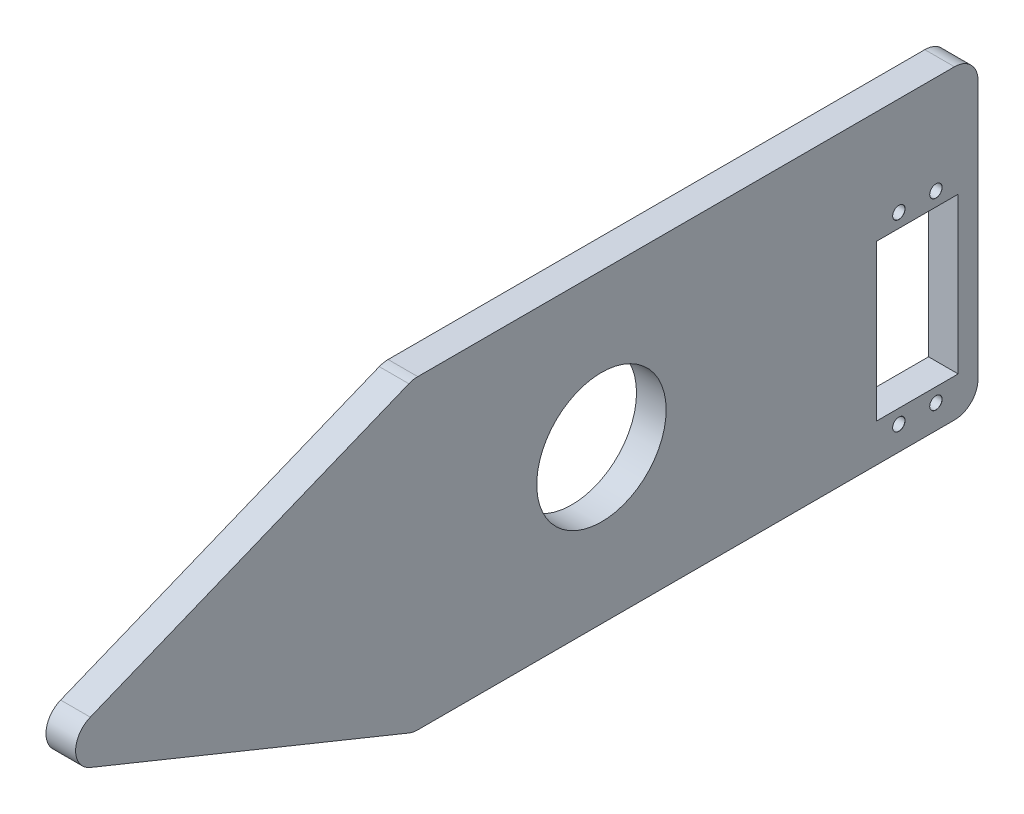
ISO-10303-21;
HEADER;
FILE_DESCRIPTION(('STEP AP214'),'2;1');
FILE_NAME('part.step','',(''),(''),'','','');
FILE_SCHEMA(('AUTOMOTIVE_DESIGN { 1 0 10303 214 1 1 1 1 }'));
ENDSEC;
DATA;
#1=APPLICATION_CONTEXT('core data for automotive mechanical design processes');
#2=APPLICATION_PROTOCOL_DEFINITION('international standard','automotive_design',2000,#1);
#3=PRODUCT_CONTEXT('',#1,'mechanical');
#4=PRODUCT('Part','Part','',(#3));
#5=PRODUCT_RELATED_PRODUCT_CATEGORY('part','',(#4));
#6=PRODUCT_DEFINITION_FORMATION('','',#4);
#7=PRODUCT_DEFINITION_CONTEXT('part definition',#1,'design');
#8=PRODUCT_DEFINITION('design','',#6,#7);
#9=PRODUCT_DEFINITION_SHAPE('','',#8);
#10=(LENGTH_UNIT() NAMED_UNIT(*) SI_UNIT(.MILLI.,.METRE.));
#11=(NAMED_UNIT(*) PLANE_ANGLE_UNIT() SI_UNIT($,.RADIAN.));
#12=(NAMED_UNIT(*) SI_UNIT($,.STERADIAN.) SOLID_ANGLE_UNIT());
#13=UNCERTAINTY_MEASURE_WITH_UNIT(LENGTH_MEASURE(1.E-05),#10,'distance_accuracy_value','');
#14=(GEOMETRIC_REPRESENTATION_CONTEXT(3) GLOBAL_UNCERTAINTY_ASSIGNED_CONTEXT((#13)) GLOBAL_UNIT_ASSIGNED_CONTEXT((#10,
#11,#12)) REPRESENTATION_CONTEXT('',''));
#15=CARTESIAN_POINT('',(0.,0.,0.));
#16=DIRECTION('',(0.,0.,1.));
#17=DIRECTION('',(1.,0.,0.));
#18=AXIS2_PLACEMENT_3D('',#15,#16,#17);
#19=CARTESIAN_POINT('',(4.0005,0.,0.));
#20=DIRECTION('',(1.,0.,0.));
#21=DIRECTION('',(0.,0.,-1.));
#22=AXIS2_PLACEMENT_3D('',#19,#20,#21);
#23=PLANE('',#22);
#24=DIRECTION('',(0.,1.,0.));
#25=VECTOR('',#24,1.);
#26=CARTESIAN_POINT('',(4.0005,-31.,-96.25));
#27=LINE('',#26,#25);
#28=CARTESIAN_POINT('',(4.0005,-31.,-96.25));
#29=VERTEX_POINT('',#28);
#30=CARTESIAN_POINT('',(4.0005,11.,-96.25));
#31=VERTEX_POINT('',#30);
#32=EDGE_CURVE('E53',#29,#31,#27,.T.);
#33=ORIENTED_EDGE('',*,*,#32,.F.);
#34=DIRECTION('',(0.,0.,-1.));
#35=VECTOR('',#34,1.);
#36=CARTESIAN_POINT('',(4.0005,-31.,-74.25));
#37=LINE('',#36,#35);
#38=CARTESIAN_POINT('',(4.0005,-31.,-74.25));
#39=VERTEX_POINT('',#38);
#40=EDGE_CURVE('E160',#39,#29,#37,.T.);
#41=ORIENTED_EDGE('',*,*,#40,.F.);
#42=DIRECTION('',(0.,-1.,0.));
#43=VECTOR('',#42,1.);
#44=CARTESIAN_POINT('',(4.0005,11.,-74.25));
#45=LINE('',#44,#43);
#46=CARTESIAN_POINT('',(4.0005,11.,-74.25));
#47=VERTEX_POINT('',#46);
#48=EDGE_CURVE('E159',#47,#39,#45,.T.);
#49=ORIENTED_EDGE('',*,*,#48,.F.);
#50=DIRECTION('',(0.,0.,1.));
#51=VECTOR('',#50,1.);
#52=CARTESIAN_POINT('',(4.0005,11.,-96.25));
#53=LINE('',#52,#51);
#54=EDGE_CURVE('E168',#31,#47,#53,.T.);
#55=ORIENTED_EDGE('',*,*,#54,.F.);
#56=EDGE_LOOP('',(#33,#41,#49,#55));
#57=FACE_BOUND('',#56,.T.);
#58=CARTESIAN_POINT('',(4.0005,-34.75,-80.25));
#59=DIRECTION('',(1.,0.,0.));
#60=DIRECTION('',(0.,0.,-1.));
#61=AXIS2_PLACEMENT_3D('',#58,#59,#60);
#62=CIRCLE('',#61,1.675);
#63=CARTESIAN_POINT('',(4.0005,-34.75,-81.925));
#64=VERTEX_POINT('',#63);
#65=EDGE_CURVE('E175',#64,#64,#62,.T.);
#66=ORIENTED_EDGE('',*,*,#65,.F.);
#67=EDGE_LOOP('',(#66));
#68=FACE_BOUND('',#67,.T.);
#69=CARTESIAN_POINT('',(4.0005,-34.75,-90.25));
#70=DIRECTION('',(1.,0.,0.));
#71=DIRECTION('',(0.,0.,-1.));
#72=AXIS2_PLACEMENT_3D('',#69,#70,#71);
#73=CIRCLE('',#72,1.675);
#74=CARTESIAN_POINT('',(4.0005,-34.75,-91.925));
#75=VERTEX_POINT('',#74);
#76=EDGE_CURVE('E183',#75,#75,#73,.T.);
#77=ORIENTED_EDGE('',*,*,#76,.F.);
#78=EDGE_LOOP('',(#77));
#79=FACE_BOUND('',#78,.T.);
#80=CARTESIAN_POINT('',(4.0005,14.75,-80.25));
#81=DIRECTION('',(1.,0.,0.));
#82=DIRECTION('',(0.,0.,-1.));
#83=AXIS2_PLACEMENT_3D('',#80,#81,#82);
#84=CIRCLE('',#83,1.675);
#85=CARTESIAN_POINT('',(4.0005,14.75,-81.925));
#86=VERTEX_POINT('',#85);
#87=EDGE_CURVE('E194',#86,#86,#84,.T.);
#88=ORIENTED_EDGE('',*,*,#87,.F.);
#89=EDGE_LOOP('',(#88));
#90=FACE_BOUND('',#89,.T.);
#91=CARTESIAN_POINT('',(4.0005,14.75,-90.25));
#92=DIRECTION('',(1.,0.,0.));
#93=DIRECTION('',(0.,0.,-1.));
#94=AXIS2_PLACEMENT_3D('',#91,#92,#93);
#95=CIRCLE('',#94,1.675);
#96=CARTESIAN_POINT('',(4.0005,14.75,-91.925));
#97=VERTEX_POINT('',#96);
#98=EDGE_CURVE('E205',#97,#97,#95,.T.);
#99=ORIENTED_EDGE('',*,*,#98,.F.);
#100=EDGE_LOOP('',(#99));
#101=FACE_BOUND('',#100,.T.);
#102=DIRECTION('',(0.,1.,0.));
#103=VECTOR('',#102,1.);
#104=CARTESIAN_POINT('',(4.0005,-41.275,-101.6));
#105=LINE('',#104,#103);
#106=CARTESIAN_POINT('',(4.0005,-34.925,-101.6));
#107=VERTEX_POINT('',#106);
#108=CARTESIAN_POINT('',(4.0005,34.925,-101.6));
#109=VERTEX_POINT('',#108);
#110=EDGE_CURVE('E224',#107,#109,#105,.T.);
#111=ORIENTED_EDGE('',*,*,#110,.T.);
#112=CARTESIAN_POINT('',(4.0005,34.925,-95.25));
#113=DIRECTION('',(1.,0.,0.));
#114=DIRECTION('',(0.,0.,-1.));
#115=AXIS2_PLACEMENT_3D('',#112,#113,#114);
#116=CIRCLE('',#115,6.35);
#117=CARTESIAN_POINT('',(4.0005,41.275,-95.25));
#118=VERTEX_POINT('',#117);
#119=EDGE_CURVE('E273',#109,#118,#116,.T.);
#120=ORIENTED_EDGE('',*,*,#119,.T.);
#121=DIRECTION('',(0.,0.,1.));
#122=VECTOR('',#121,1.);
#123=CARTESIAN_POINT('',(4.0005,41.275,-101.6));
#124=LINE('',#123,#122);
#125=CARTESIAN_POINT('',(4.0005,41.275,49.5593897155795));
#126=VERTEX_POINT('',#125);
#127=EDGE_CURVE('E226',#118,#126,#124,.T.);
#128=ORIENTED_EDGE('',*,*,#127,.T.);
#129=CARTESIAN_POINT('',(4.0005,34.925,49.5593897155796));
#130=DIRECTION('',(1.,0.,0.));
#131=DIRECTION('',(0.,0.,-1.));
#132=AXIS2_PLACEMENT_3D('',#129,#130,#131);
#133=CIRCLE('',#132,6.35);
#134=CARTESIAN_POINT('',(4.0005,40.8080627647267,51.9493839637498));
#135=VERTEX_POINT('',#134);
#136=EDGE_CURVE('E270',#126,#135,#133,.T.);
#137=ORIENTED_EDGE('',*,*,#136,.T.);
#138=DIRECTION('',(0.,-0.376377046955938,0.926466577122309));
#139=VECTOR('',#138,1.);
#140=CARTESIAN_POINT('',(4.0005,41.275,50.8));
#141=LINE('',#140,#139);
#142=CARTESIAN_POINT('',(4.0005,5.88306276472666,137.918614732981));
#143=VERTEX_POINT('',#142);
#144=EDGE_CURVE('E233',#135,#143,#141,.T.);
#145=ORIENTED_EDGE('',*,*,#144,.T.);
#146=CARTESIAN_POINT('',(4.0005,0.,135.52862048481));
#147=DIRECTION('',(1.,0.,0.));
#148=DIRECTION('',(0.,0.,-1.));
#149=AXIS2_PLACEMENT_3D('',#146,#147,#148);
#150=CIRCLE('',#149,6.35);
#151=CARTESIAN_POINT('',(4.0005,-5.88306276472666,137.918614732981));
#152=VERTEX_POINT('',#151);
#153=EDGE_CURVE('E272',#143,#152,#150,.T.);
#154=ORIENTED_EDGE('',*,*,#153,.T.);
#155=DIRECTION('',(0.,-0.376377046955938,-0.926466577122309));
#156=VECTOR('',#155,1.);
#157=CARTESIAN_POINT('',(4.0005,0.,152.4));
#158=LINE('',#157,#156);
#159=CARTESIAN_POINT('',(4.0005,-40.8080627647266,51.9493839637498));
#160=VERTEX_POINT('',#159);
#161=EDGE_CURVE('E218',#152,#160,#158,.T.);
#162=ORIENTED_EDGE('',*,*,#161,.T.);
#163=CARTESIAN_POINT('',(4.0005,-34.925,49.5593897155795));
#164=DIRECTION('',(1.,0.,0.));
#165=DIRECTION('',(0.,0.,-1.));
#166=AXIS2_PLACEMENT_3D('',#163,#164,#165);
#167=CIRCLE('',#166,6.35);
#168=CARTESIAN_POINT('',(4.0005,-41.275,49.5593897155795));
#169=VERTEX_POINT('',#168);
#170=EDGE_CURVE('E268',#160,#169,#167,.T.);
#171=ORIENTED_EDGE('',*,*,#170,.T.);
#172=DIRECTION('',(0.,0.,-1.));
#173=VECTOR('',#172,1.);
#174=CARTESIAN_POINT('',(4.0005,-41.275,50.8));
#175=LINE('',#174,#173);
#176=CARTESIAN_POINT('',(4.0005,-41.275,-95.25));
#177=VERTEX_POINT('',#176);
#178=EDGE_CURVE('E221',#169,#177,#175,.T.);
#179=ORIENTED_EDGE('',*,*,#178,.T.);
#180=CARTESIAN_POINT('',(4.0005,-34.925,-95.25));
#181=DIRECTION('',(1.,0.,0.));
#182=DIRECTION('',(0.,0.,-1.));
#183=AXIS2_PLACEMENT_3D('',#180,#181,#182);
#184=CIRCLE('',#183,6.35);
#185=EDGE_CURVE('E271',#177,#107,#184,.T.);
#186=ORIENTED_EDGE('',*,*,#185,.T.);
#187=EDGE_LOOP('',(#111,#120,#128,#137,#145,#154,#162,#171,#179,#186));
#188=FACE_BOUND('',#187,.T.);
#189=CARTESIAN_POINT('',(4.0005,0.,0.));
#190=DIRECTION('',(1.,0.,0.));
#191=DIRECTION('',(0.,0.,-1.));
#192=AXIS2_PLACEMENT_3D('',#189,#190,#191);
#193=CIRCLE('',#192,17.4625);
#194=CARTESIAN_POINT('',(4.0005,0.,-17.4625));
#195=VERTEX_POINT('',#194);
#196=EDGE_CURVE('E215',#195,#195,#193,.T.);
#197=ORIENTED_EDGE('',*,*,#196,.F.);
#198=EDGE_LOOP('',(#197));
#199=FACE_BOUND('',#198,.T.);
#200=ADVANCED_FACE('F39',(#57,#68,#79,#90,#101,#188,#199),#23,.T.);
#201=CARTESIAN_POINT('',(-4.0005,0.,0.));
#202=DIRECTION('',(1.,0.,0.));
#203=DIRECTION('',(0.,0.,-1.));
#204=AXIS2_PLACEMENT_3D('',#201,#202,#203);
#205=PLANE('',#204);
#206=DIRECTION('',(0.,0.,-1.));
#207=VECTOR('',#206,1.);
#208=CARTESIAN_POINT('',(-4.0005,-31.,-74.25));
#209=LINE('',#208,#207);
#210=CARTESIAN_POINT('',(-4.0005,-31.,-74.25));
#211=VERTEX_POINT('',#210);
#212=CARTESIAN_POINT('',(-4.0005,-31.,-96.25));
#213=VERTEX_POINT('',#212);
#214=EDGE_CURVE('E150',#211,#213,#209,.T.);
#215=ORIENTED_EDGE('',*,*,#214,.T.);
#216=DIRECTION('',(0.,1.,0.));
#217=VECTOR('',#216,1.);
#218=CARTESIAN_POINT('',(-4.0005,-31.,-96.25));
#219=LINE('',#218,#217);
#220=CARTESIAN_POINT('',(-4.0005,11.,-96.25));
#221=VERTEX_POINT('',#220);
#222=EDGE_CURVE('E142',#213,#221,#219,.T.);
#223=ORIENTED_EDGE('',*,*,#222,.T.);
#224=DIRECTION('',(0.,0.,1.));
#225=VECTOR('',#224,1.);
#226=CARTESIAN_POINT('',(-4.0005,11.,-96.25));
#227=LINE('',#226,#225);
#228=CARTESIAN_POINT('',(-4.0005,11.,-74.25));
#229=VERTEX_POINT('',#228);
#230=EDGE_CURVE('E148',#221,#229,#227,.T.);
#231=ORIENTED_EDGE('',*,*,#230,.T.);
#232=DIRECTION('',(0.,-1.,0.));
#233=VECTOR('',#232,1.);
#234=CARTESIAN_POINT('',(-4.0005,11.,-74.25));
#235=LINE('',#234,#233);
#236=EDGE_CURVE('E65',#229,#211,#235,.T.);
#237=ORIENTED_EDGE('',*,*,#236,.T.);
#238=EDGE_LOOP('',(#215,#223,#231,#237));
#239=FACE_BOUND('',#238,.T.);
#240=CARTESIAN_POINT('',(-4.0005,-34.75,-80.25));
#241=DIRECTION('',(1.,0.,0.));
#242=DIRECTION('',(0.,0.,-1.));
#243=AXIS2_PLACEMENT_3D('',#240,#241,#242);
#244=CIRCLE('',#243,1.65);
#245=CARTESIAN_POINT('',(-4.0005,-34.75,-81.9));
#246=VERTEX_POINT('',#245);
#247=EDGE_CURVE('E181',#246,#246,#244,.T.);
#248=ORIENTED_EDGE('',*,*,#247,.T.);
#249=EDGE_LOOP('',(#248));
#250=FACE_BOUND('',#249,.T.);
#251=CARTESIAN_POINT('',(-4.0005,-34.75,-90.25));
#252=DIRECTION('',(1.,0.,0.));
#253=DIRECTION('',(0.,0.,-1.));
#254=AXIS2_PLACEMENT_3D('',#251,#252,#253);
#255=CIRCLE('',#254,1.65);
#256=CARTESIAN_POINT('',(-4.0005,-34.75,-91.9));
#257=VERTEX_POINT('',#256);
#258=EDGE_CURVE('E188',#257,#257,#255,.T.);
#259=ORIENTED_EDGE('',*,*,#258,.T.);
#260=EDGE_LOOP('',(#259));
#261=FACE_BOUND('',#260,.T.);
#262=CARTESIAN_POINT('',(-4.0005,14.75,-80.25));
#263=DIRECTION('',(1.,0.,0.));
#264=DIRECTION('',(0.,0.,-1.));
#265=AXIS2_PLACEMENT_3D('',#262,#263,#264);
#266=CIRCLE('',#265,1.65);
#267=CARTESIAN_POINT('',(-4.0005,14.75,-81.9));
#268=VERTEX_POINT('',#267);
#269=EDGE_CURVE('E197',#268,#268,#266,.T.);
#270=ORIENTED_EDGE('',*,*,#269,.T.);
#271=EDGE_LOOP('',(#270));
#272=FACE_BOUND('',#271,.T.);
#273=CARTESIAN_POINT('',(-4.0005,14.75,-90.25));
#274=DIRECTION('',(1.,0.,0.));
#275=DIRECTION('',(0.,0.,-1.));
#276=AXIS2_PLACEMENT_3D('',#273,#274,#275);
#277=CIRCLE('',#276,1.65);
#278=CARTESIAN_POINT('',(-4.0005,14.75,-91.9));
#279=VERTEX_POINT('',#278);
#280=EDGE_CURVE('E206',#279,#279,#277,.T.);
#281=ORIENTED_EDGE('',*,*,#280,.T.);
#282=EDGE_LOOP('',(#281));
#283=FACE_BOUND('',#282,.T.);
#284=DIRECTION('',(0.,0.,1.));
#285=VECTOR('',#284,1.);
#286=CARTESIAN_POINT('',(-4.0005,41.275,-101.6));
#287=LINE('',#286,#285);
#288=CARTESIAN_POINT('',(-4.0005,41.275,-95.25));
#289=VERTEX_POINT('',#288);
#290=CARTESIAN_POINT('',(-4.0005,41.275,49.5593897155795));
#291=VERTEX_POINT('',#290);
#292=EDGE_CURVE('E243',#289,#291,#287,.T.);
#293=ORIENTED_EDGE('',*,*,#292,.F.);
#294=CARTESIAN_POINT('',(-4.0005,34.925,-95.25));
#295=DIRECTION('',(1.,0.,0.));
#296=DIRECTION('',(0.,0.,-1.));
#297=AXIS2_PLACEMENT_3D('',#294,#295,#296);
#298=CIRCLE('',#297,6.35);
#299=CARTESIAN_POINT('',(-4.0005,34.925,-101.6));
#300=VERTEX_POINT('',#299);
#301=EDGE_CURVE('E258',#289,#300,#298,.F.);
#302=ORIENTED_EDGE('',*,*,#301,.T.);
#303=DIRECTION('',(0.,1.,0.));
#304=VECTOR('',#303,1.);
#305=CARTESIAN_POINT('',(-4.0005,-41.275,-101.6));
#306=LINE('',#305,#304);
#307=CARTESIAN_POINT('',(-4.0005,-34.925,-101.6));
#308=VERTEX_POINT('',#307);
#309=EDGE_CURVE('E239',#308,#300,#306,.T.);
#310=ORIENTED_EDGE('',*,*,#309,.F.);
#311=CARTESIAN_POINT('',(-4.0005,-34.925,-95.25));
#312=DIRECTION('',(1.,0.,0.));
#313=DIRECTION('',(0.,0.,-1.));
#314=AXIS2_PLACEMENT_3D('',#311,#312,#313);
#315=CIRCLE('',#314,6.35);
#316=CARTESIAN_POINT('',(-4.0005,-41.275,-95.25));
#317=VERTEX_POINT('',#316);
#318=EDGE_CURVE('E259',#308,#317,#315,.F.);
#319=ORIENTED_EDGE('',*,*,#318,.T.);
#320=DIRECTION('',(0.,0.,-1.));
#321=VECTOR('',#320,1.);
#322=CARTESIAN_POINT('',(-4.0005,-41.275,50.8));
#323=LINE('',#322,#321);
#324=CARTESIAN_POINT('',(-4.0005,-41.275,49.5593897155795));
#325=VERTEX_POINT('',#324);
#326=EDGE_CURVE('E240',#325,#317,#323,.T.);
#327=ORIENTED_EDGE('',*,*,#326,.F.);
#328=CARTESIAN_POINT('',(-4.0005,-34.925,49.5593897155795));
#329=DIRECTION('',(1.,0.,0.));
#330=DIRECTION('',(0.,0.,-1.));
#331=AXIS2_PLACEMENT_3D('',#328,#329,#330);
#332=CIRCLE('',#331,6.35);
#333=CARTESIAN_POINT('',(-4.0005,-40.8080627647266,51.9493839637498));
#334=VERTEX_POINT('',#333);
#335=EDGE_CURVE('E251',#325,#334,#332,.F.);
#336=ORIENTED_EDGE('',*,*,#335,.T.);
#337=DIRECTION('',(0.,-0.376377046955938,-0.926466577122309));
#338=VECTOR('',#337,1.);
#339=CARTESIAN_POINT('',(-4.0005,0.,152.4));
#340=LINE('',#339,#338);
#341=CARTESIAN_POINT('',(-4.0005,-5.88306276472666,137.918614732981));
#342=VERTEX_POINT('',#341);
#343=EDGE_CURVE('E213',#342,#334,#340,.T.);
#344=ORIENTED_EDGE('',*,*,#343,.F.);
#345=CARTESIAN_POINT('',(-4.0005,0.,135.52862048481));
#346=DIRECTION('',(1.,0.,0.));
#347=DIRECTION('',(0.,0.,-1.));
#348=AXIS2_PLACEMENT_3D('',#345,#346,#347);
#349=CIRCLE('',#348,6.35);
#350=CARTESIAN_POINT('',(-4.0005,5.88306276472666,137.918614732981));
#351=VERTEX_POINT('',#350);
#352=EDGE_CURVE('E257',#342,#351,#349,.F.);
#353=ORIENTED_EDGE('',*,*,#352,.T.);
#354=DIRECTION('',(0.,-0.376377046955938,0.926466577122309));
#355=VECTOR('',#354,1.);
#356=CARTESIAN_POINT('',(-4.0005,41.275,50.8));
#357=LINE('',#356,#355);
#358=CARTESIAN_POINT('',(-4.0005,40.8080627647267,51.9493839637498));
#359=VERTEX_POINT('',#358);
#360=EDGE_CURVE('E225',#359,#351,#357,.T.);
#361=ORIENTED_EDGE('',*,*,#360,.F.);
#362=CARTESIAN_POINT('',(-4.0005,34.925,49.5593897155796));
#363=DIRECTION('',(1.,0.,0.));
#364=DIRECTION('',(0.,0.,-1.));
#365=AXIS2_PLACEMENT_3D('',#362,#363,#364);
#366=CIRCLE('',#365,6.35);
#367=EDGE_CURVE('E255',#359,#291,#366,.F.);
#368=ORIENTED_EDGE('',*,*,#367,.T.);
#369=EDGE_LOOP('',(#293,#302,#310,#319,#327,#336,#344,#353,#361,#368));
#370=FACE_BOUND('',#369,.T.);
#371=CARTESIAN_POINT('',(-4.0005,0.,0.));
#372=DIRECTION('',(1.,0.,0.));
#373=DIRECTION('',(0.,0.,-1.));
#374=AXIS2_PLACEMENT_3D('',#371,#372,#373);
#375=CIRCLE('',#374,17.4625);
#376=CARTESIAN_POINT('',(-4.0005,0.,-17.4625));
#377=VERTEX_POINT('',#376);
#378=EDGE_CURVE('E212',#377,#377,#375,.T.);
#379=ORIENTED_EDGE('',*,*,#378,.T.);
#380=EDGE_LOOP('',(#379));
#381=FACE_BOUND('',#380,.T.);
#382=ADVANCED_FACE('F152',(#239,#250,#261,#272,#283,#370,#381),#205,.F.);
#383=CARTESIAN_POINT('',(4.0005,0.,152.4));
#384=DIRECTION('',(0.,0.926466577122309,-0.376377046955938));
#385=DIRECTION('',(0.,0.376377046955938,0.926466577122309));
#386=AXIS2_PLACEMENT_3D('',#383,#384,#385);
#387=PLANE('',#386);
#388=ORIENTED_EDGE('',*,*,#161,.F.);
#389=DIRECTION('',(-1.,0.,0.));
#390=VECTOR('',#389,1.);
#391=CARTESIAN_POINT('',(4.0005,-5.88306276472666,137.918614732981));
#392=LINE('',#391,#390);
#393=EDGE_CURVE('E282',#152,#342,#392,.T.);
#394=ORIENTED_EDGE('',*,*,#393,.T.);
#395=ORIENTED_EDGE('',*,*,#343,.T.);
#396=DIRECTION('',(-1.,0.,0.));
#397=VECTOR('',#396,1.);
#398=CARTESIAN_POINT('',(4.0005,-40.8080627647267,51.9493839637497));
#399=LINE('',#398,#397);
#400=EDGE_CURVE('E285',#334,#160,#399,.F.);
#401=ORIENTED_EDGE('',*,*,#400,.T.);
#402=EDGE_LOOP('',(#388,#394,#395,#401));
#403=FACE_BOUND('',#402,.T.);
#404=ADVANCED_FACE('F304',(#403),#387,.F.);
#405=CARTESIAN_POINT('',(4.0005,-41.275,50.8));
#406=DIRECTION('',(0.,1.,0.));
#407=DIRECTION('',(0.,0.,1.));
#408=AXIS2_PLACEMENT_3D('',#405,#406,#407);
#409=PLANE('',#408);
#410=ORIENTED_EDGE('',*,*,#326,.T.);
#411=DIRECTION('',(-1.,0.,0.));
#412=VECTOR('',#411,1.);
#413=CARTESIAN_POINT('',(4.0005,-41.275,-95.25));
#414=LINE('',#413,#412);
#415=EDGE_CURVE('E278',#317,#177,#414,.F.);
#416=ORIENTED_EDGE('',*,*,#415,.T.);
#417=ORIENTED_EDGE('',*,*,#178,.F.);
#418=DIRECTION('',(-1.,0.,0.));
#419=VECTOR('',#418,1.);
#420=CARTESIAN_POINT('',(4.0005,-41.275,49.5593897155795));
#421=LINE('',#420,#419);
#422=EDGE_CURVE('E280',#169,#325,#421,.T.);
#423=ORIENTED_EDGE('',*,*,#422,.T.);
#424=EDGE_LOOP('',(#410,#416,#417,#423));
#425=FACE_BOUND('',#424,.T.);
#426=ADVANCED_FACE('F317',(#425),#409,.F.);
#427=CARTESIAN_POINT('',(4.0005,-41.275,-101.6));
#428=DIRECTION('',(0.,0.,1.));
#429=DIRECTION('',(0.,-1.,0.));
#430=AXIS2_PLACEMENT_3D('',#427,#428,#429);
#431=PLANE('',#430);
#432=ORIENTED_EDGE('',*,*,#309,.T.);
#433=DIRECTION('',(-1.,0.,0.));
#434=VECTOR('',#433,1.);
#435=CARTESIAN_POINT('',(4.0005,34.925,-101.6));
#436=LINE('',#435,#434);
#437=EDGE_CURVE('E264',#300,#109,#436,.F.);
#438=ORIENTED_EDGE('',*,*,#437,.T.);
#439=ORIENTED_EDGE('',*,*,#110,.F.);
#440=DIRECTION('',(-1.,0.,0.));
#441=VECTOR('',#440,1.);
#442=CARTESIAN_POINT('',(4.0005,-34.925,-101.6));
#443=LINE('',#442,#441);
#444=EDGE_CURVE('E265',#107,#308,#443,.T.);
#445=ORIENTED_EDGE('',*,*,#444,.T.);
#446=EDGE_LOOP('',(#432,#438,#439,#445));
#447=FACE_BOUND('',#446,.T.);
#448=ADVANCED_FACE('F323',(#447),#431,.F.);
#449=CARTESIAN_POINT('',(4.0005,41.275,-101.6));
#450=DIRECTION('',(0.,-1.,0.));
#451=DIRECTION('',(0.,0.,-1.));
#452=AXIS2_PLACEMENT_3D('',#449,#450,#451);
#453=PLANE('',#452);
#454=ORIENTED_EDGE('',*,*,#127,.F.);
#455=DIRECTION('',(-1.,0.,0.));
#456=VECTOR('',#455,1.);
#457=CARTESIAN_POINT('',(4.0005,41.275,-95.25));
#458=LINE('',#457,#456);
#459=EDGE_CURVE('E248',#118,#289,#458,.T.);
#460=ORIENTED_EDGE('',*,*,#459,.T.);
#461=ORIENTED_EDGE('',*,*,#292,.T.);
#462=DIRECTION('',(-1.,0.,0.));
#463=VECTOR('',#462,1.);
#464=CARTESIAN_POINT('',(4.0005,41.275,49.5593897155795));
#465=LINE('',#464,#463);
#466=EDGE_CURVE('E234',#291,#126,#465,.F.);
#467=ORIENTED_EDGE('',*,*,#466,.T.);
#468=EDGE_LOOP('',(#454,#460,#461,#467));
#469=FACE_BOUND('',#468,.T.);
#470=ADVANCED_FACE('F332',(#469),#453,.F.);
#471=CARTESIAN_POINT('',(4.0005,41.275,50.8));
#472=DIRECTION('',(0.,-0.926466577122309,-0.376377046955938));
#473=DIRECTION('',(0.,0.376377046955938,-0.926466577122309));
#474=AXIS2_PLACEMENT_3D('',#471,#472,#473);
#475=PLANE('',#474);
#476=ORIENTED_EDGE('',*,*,#360,.T.);
#477=DIRECTION('',(-1.,0.,0.));
#478=VECTOR('',#477,1.);
#479=CARTESIAN_POINT('',(4.0005,5.88306276472666,137.918614732981));
#480=LINE('',#479,#478);
#481=EDGE_CURVE('E11',#351,#143,#480,.F.);
#482=ORIENTED_EDGE('',*,*,#481,.T.);
#483=ORIENTED_EDGE('',*,*,#144,.F.);
#484=DIRECTION('',(-1.,0.,0.));
#485=VECTOR('',#484,1.);
#486=CARTESIAN_POINT('',(4.0005,40.8080627647267,51.9493839637498));
#487=LINE('',#486,#485);
#488=EDGE_CURVE('E50',#135,#359,#487,.T.);
#489=ORIENTED_EDGE('',*,*,#488,.T.);
#490=EDGE_LOOP('',(#476,#482,#483,#489));
#491=FACE_BOUND('',#490,.T.);
#492=ADVANCED_FACE('F293',(#491),#475,.F.);
#493=CARTESIAN_POINT('',(4.0005,0.,0.));
#494=DIRECTION('',(-1.,0.,0.));
#495=DIRECTION('',(0.,0.,1.));
#496=AXIS2_PLACEMENT_3D('',#493,#494,#495);
#497=CYLINDRICAL_SURFACE('',#496,17.4625);
#498=ORIENTED_EDGE('',*,*,#196,.T.);
#499=EDGE_LOOP('',(#498));
#500=FACE_BOUND('',#499,.T.);
#501=ORIENTED_EDGE('',*,*,#378,.F.);
#502=EDGE_LOOP('',(#501));
#503=FACE_BOUND('',#502,.T.);
#504=ADVANCED_FACE('F353',(#500,#503),#497,.F.);
#505=CARTESIAN_POINT('',(4.0005,34.925,-95.25));
#506=DIRECTION('',(-1.,0.,0.));
#507=DIRECTION('',(0.,0.,1.));
#508=AXIS2_PLACEMENT_3D('',#505,#506,#507);
#509=CYLINDRICAL_SURFACE('',#508,6.35);
#510=ORIENTED_EDGE('',*,*,#119,.F.);
#511=ORIENTED_EDGE('',*,*,#437,.F.);
#512=ORIENTED_EDGE('',*,*,#301,.F.);
#513=ORIENTED_EDGE('',*,*,#459,.F.);
#514=EDGE_LOOP('',(#510,#511,#512,#513));
#515=FACE_BOUND('',#514,.T.);
#516=ADVANCED_FACE('F331',(#515),#509,.T.);
#517=CARTESIAN_POINT('',(4.0005,-34.925,-95.25));
#518=DIRECTION('',(-1.,0.,0.));
#519=DIRECTION('',(0.,0.,1.));
#520=AXIS2_PLACEMENT_3D('',#517,#518,#519);
#521=CYLINDRICAL_SURFACE('',#520,6.35);
#522=ORIENTED_EDGE('',*,*,#185,.F.);
#523=ORIENTED_EDGE('',*,*,#415,.F.);
#524=ORIENTED_EDGE('',*,*,#318,.F.);
#525=ORIENTED_EDGE('',*,*,#444,.F.);
#526=EDGE_LOOP('',(#522,#523,#524,#525));
#527=FACE_BOUND('',#526,.T.);
#528=ADVANCED_FACE('F325',(#527),#521,.T.);
#529=CARTESIAN_POINT('',(4.0005,0.,135.52862048481));
#530=DIRECTION('',(-1.,0.,0.));
#531=DIRECTION('',(0.,0.,1.));
#532=AXIS2_PLACEMENT_3D('',#529,#530,#531);
#533=CYLINDRICAL_SURFACE('',#532,6.35);
#534=ORIENTED_EDGE('',*,*,#153,.F.);
#535=ORIENTED_EDGE('',*,*,#481,.F.);
#536=ORIENTED_EDGE('',*,*,#352,.F.);
#537=ORIENTED_EDGE('',*,*,#393,.F.);
#538=EDGE_LOOP('',(#534,#535,#536,#537));
#539=FACE_BOUND('',#538,.T.);
#540=ADVANCED_FACE('F305',(#539),#533,.T.);
#541=CARTESIAN_POINT('',(4.0005,-34.925,49.5593897155795));
#542=DIRECTION('',(-1.,0.,0.));
#543=DIRECTION('',(0.,0.,1.));
#544=AXIS2_PLACEMENT_3D('',#541,#542,#543);
#545=CYLINDRICAL_SURFACE('',#544,6.35);
#546=ORIENTED_EDGE('',*,*,#170,.F.);
#547=ORIENTED_EDGE('',*,*,#400,.F.);
#548=ORIENTED_EDGE('',*,*,#335,.F.);
#549=ORIENTED_EDGE('',*,*,#422,.F.);
#550=EDGE_LOOP('',(#546,#547,#548,#549));
#551=FACE_BOUND('',#550,.T.);
#552=ADVANCED_FACE('F312',(#551),#545,.T.);
#553=CARTESIAN_POINT('',(4.0005,34.925,49.5593897155796));
#554=DIRECTION('',(-1.,0.,0.));
#555=DIRECTION('',(0.,0.,1.));
#556=AXIS2_PLACEMENT_3D('',#553,#554,#555);
#557=CYLINDRICAL_SURFACE('',#556,6.35);
#558=ORIENTED_EDGE('',*,*,#136,.F.);
#559=ORIENTED_EDGE('',*,*,#466,.F.);
#560=ORIENTED_EDGE('',*,*,#367,.F.);
#561=ORIENTED_EDGE('',*,*,#488,.F.);
#562=EDGE_LOOP('',(#558,#559,#560,#561));
#563=FACE_BOUND('',#562,.T.);
#564=ADVANCED_FACE('F41',(#563),#557,.T.);
#565=CARTESIAN_POINT('',(4.0005,14.75,-90.25));
#566=DIRECTION('',(1.,0.,0.));
#567=DIRECTION('',(0.,0.,-1.));
#568=AXIS2_PLACEMENT_3D('',#565,#566,#567);
#569=CYLINDRICAL_SURFACE('',#568,1.65);
#570=ORIENTED_EDGE('',*,*,#280,.F.);
#571=EDGE_LOOP('',(#570));
#572=FACE_BOUND('',#571,.T.);
#573=CARTESIAN_POINT('',(3.9755,14.75,-90.25));
#574=DIRECTION('',(1.,0.,0.));
#575=DIRECTION('',(0.,0.,-1.));
#576=AXIS2_PLACEMENT_3D('',#573,#574,#575);
#577=CIRCLE('',#576,1.65);
#578=CARTESIAN_POINT('',(3.9755,14.75,-91.9));
#579=VERTEX_POINT('',#578);
#580=EDGE_CURVE('E204',#579,#579,#577,.T.);
#581=ORIENTED_EDGE('',*,*,#580,.T.);
#582=EDGE_LOOP('',(#581));
#583=FACE_BOUND('',#582,.T.);
#584=ADVANCED_FACE('F337',(#572,#583),#569,.F.);
#585=CARTESIAN_POINT('',(4.0005,14.75,-90.25));
#586=DIRECTION('',(1.,0.,0.));
#587=DIRECTION('',(0.,0.,-1.));
#588=AXIS2_PLACEMENT_3D('',#585,#586,#587);
#589=CONICAL_SURFACE('',#588,1.675,0.785398163397431);
#590=ORIENTED_EDGE('',*,*,#580,.F.);
#591=EDGE_LOOP('',(#590));
#592=FACE_BOUND('',#591,.T.);
#593=ORIENTED_EDGE('',*,*,#98,.T.);
#594=EDGE_LOOP('',(#593));
#595=FACE_BOUND('',#594,.T.);
#596=ADVANCED_FACE('F342',(#592,#595),#589,.F.);
#597=CARTESIAN_POINT('',(4.0005,14.75,-80.25));
#598=DIRECTION('',(1.,0.,0.));
#599=DIRECTION('',(0.,0.,-1.));
#600=AXIS2_PLACEMENT_3D('',#597,#598,#599);
#601=CYLINDRICAL_SURFACE('',#600,1.65);
#602=ORIENTED_EDGE('',*,*,#269,.F.);
#603=EDGE_LOOP('',(#602));
#604=FACE_BOUND('',#603,.T.);
#605=CARTESIAN_POINT('',(3.9755,14.75,-80.25));
#606=DIRECTION('',(1.,0.,0.));
#607=DIRECTION('',(0.,0.,-1.));
#608=AXIS2_PLACEMENT_3D('',#605,#606,#607);
#609=CIRCLE('',#608,1.65);
#610=CARTESIAN_POINT('',(3.9755,14.75,-81.9));
#611=VERTEX_POINT('',#610);
#612=EDGE_CURVE('E196',#611,#611,#609,.T.);
#613=ORIENTED_EDGE('',*,*,#612,.T.);
#614=EDGE_LOOP('',(#613));
#615=FACE_BOUND('',#614,.T.);
#616=ADVANCED_FACE('F399',(#604,#615),#601,.F.);
#617=CARTESIAN_POINT('',(4.0005,14.75,-80.25));
#618=DIRECTION('',(1.,0.,0.));
#619=DIRECTION('',(0.,0.,-1.));
#620=AXIS2_PLACEMENT_3D('',#617,#618,#619);
#621=CONICAL_SURFACE('',#620,1.675,0.785398163397431);
#622=ORIENTED_EDGE('',*,*,#612,.F.);
#623=EDGE_LOOP('',(#622));
#624=FACE_BOUND('',#623,.T.);
#625=ORIENTED_EDGE('',*,*,#87,.T.);
#626=EDGE_LOOP('',(#625));
#627=FACE_BOUND('',#626,.T.);
#628=ADVANCED_FACE('F408',(#624,#627),#621,.F.);
#629=CARTESIAN_POINT('',(4.0005,-34.75,-90.25));
#630=DIRECTION('',(1.,0.,0.));
#631=DIRECTION('',(0.,0.,-1.));
#632=AXIS2_PLACEMENT_3D('',#629,#630,#631);
#633=CYLINDRICAL_SURFACE('',#632,1.65);
#634=ORIENTED_EDGE('',*,*,#258,.F.);
#635=EDGE_LOOP('',(#634));
#636=FACE_BOUND('',#635,.T.);
#637=CARTESIAN_POINT('',(3.9755,-34.75,-90.25));
#638=DIRECTION('',(1.,0.,0.));
#639=DIRECTION('',(0.,0.,-1.));
#640=AXIS2_PLACEMENT_3D('',#637,#638,#639);
#641=CIRCLE('',#640,1.65);
#642=CARTESIAN_POINT('',(3.9755,-34.75,-91.9));
#643=VERTEX_POINT('',#642);
#644=EDGE_CURVE('E190',#643,#643,#641,.T.);
#645=ORIENTED_EDGE('',*,*,#644,.T.);
#646=EDGE_LOOP('',(#645));
#647=FACE_BOUND('',#646,.T.);
#648=ADVANCED_FACE('F419',(#636,#647),#633,.F.);
#649=CARTESIAN_POINT('',(4.0005,-34.75,-90.25));
#650=DIRECTION('',(1.,0.,0.));
#651=DIRECTION('',(0.,0.,-1.));
#652=AXIS2_PLACEMENT_3D('',#649,#650,#651);
#653=CONICAL_SURFACE('',#652,1.675,0.7853981633975);
#654=ORIENTED_EDGE('',*,*,#644,.F.);
#655=EDGE_LOOP('',(#654));
#656=FACE_BOUND('',#655,.T.);
#657=ORIENTED_EDGE('',*,*,#76,.T.);
#658=EDGE_LOOP('',(#657));
#659=FACE_BOUND('',#658,.T.);
#660=ADVANCED_FACE('F427',(#656,#659),#653,.F.);
#661=CARTESIAN_POINT('',(4.0005,-34.75,-80.25));
#662=DIRECTION('',(1.,0.,0.));
#663=DIRECTION('',(0.,0.,-1.));
#664=AXIS2_PLACEMENT_3D('',#661,#662,#663);
#665=CYLINDRICAL_SURFACE('',#664,1.65);
#666=ORIENTED_EDGE('',*,*,#247,.F.);
#667=EDGE_LOOP('',(#666));
#668=FACE_BOUND('',#667,.T.);
#669=CARTESIAN_POINT('',(3.9755,-34.75,-80.25));
#670=DIRECTION('',(1.,0.,0.));
#671=DIRECTION('',(0.,0.,-1.));
#672=AXIS2_PLACEMENT_3D('',#669,#670,#671);
#673=CIRCLE('',#672,1.65);
#674=CARTESIAN_POINT('',(3.9755,-34.75,-81.9));
#675=VERTEX_POINT('',#674);
#676=EDGE_CURVE('E178',#675,#675,#673,.T.);
#677=ORIENTED_EDGE('',*,*,#676,.T.);
#678=EDGE_LOOP('',(#677));
#679=FACE_BOUND('',#678,.T.);
#680=ADVANCED_FACE('F439',(#668,#679),#665,.F.);
#681=CARTESIAN_POINT('',(4.0005,-34.75,-80.25));
#682=DIRECTION('',(1.,0.,0.));
#683=DIRECTION('',(0.,0.,-1.));
#684=AXIS2_PLACEMENT_3D('',#681,#682,#683);
#685=CONICAL_SURFACE('',#684,1.675,0.7853981633975);
#686=ORIENTED_EDGE('',*,*,#676,.F.);
#687=EDGE_LOOP('',(#686));
#688=FACE_BOUND('',#687,.T.);
#689=ORIENTED_EDGE('',*,*,#65,.T.);
#690=EDGE_LOOP('',(#689));
#691=FACE_BOUND('',#690,.T.);
#692=ADVANCED_FACE('F448',(#688,#691),#685,.F.);
#693=CARTESIAN_POINT('',(-4.0005,-31.,-96.25));
#694=DIRECTION('',(0.,0.,-1.));
#695=DIRECTION('',(-1.,0.,0.));
#696=AXIS2_PLACEMENT_3D('',#693,#694,#695);
#697=PLANE('',#696);
#698=ORIENTED_EDGE('',*,*,#32,.T.);
#699=DIRECTION('',(1.,0.,0.));
#700=VECTOR('',#699,1.);
#701=CARTESIAN_POINT('',(-4.0005,11.,-96.25));
#702=LINE('',#701,#700);
#703=EDGE_CURVE('E140',#221,#31,#702,.T.);
#704=ORIENTED_EDGE('',*,*,#703,.F.);
#705=ORIENTED_EDGE('',*,*,#222,.F.);
#706=DIRECTION('',(1.,0.,0.));
#707=VECTOR('',#706,1.);
#708=CARTESIAN_POINT('',(-4.0005,-31.,-96.25));
#709=LINE('',#708,#707);
#710=EDGE_CURVE('E167',#213,#29,#709,.T.);
#711=ORIENTED_EDGE('',*,*,#710,.T.);
#712=EDGE_LOOP('',(#698,#704,#705,#711));
#713=FACE_BOUND('',#712,.T.);
#714=ADVANCED_FACE('F138',(#713),#697,.F.);
#715=CARTESIAN_POINT('',(-4.0005,-31.,-74.25));
#716=DIRECTION('',(0.,-1.,0.));
#717=DIRECTION('',(0.,0.,-1.));
#718=AXIS2_PLACEMENT_3D('',#715,#716,#717);
#719=PLANE('',#718);
#720=ORIENTED_EDGE('',*,*,#40,.T.);
#721=ORIENTED_EDGE('',*,*,#710,.F.);
#722=ORIENTED_EDGE('',*,*,#214,.F.);
#723=DIRECTION('',(1.,0.,0.));
#724=VECTOR('',#723,1.);
#725=CARTESIAN_POINT('',(-4.0005,-31.,-74.25));
#726=LINE('',#725,#724);
#727=EDGE_CURVE('E173',#211,#39,#726,.T.);
#728=ORIENTED_EDGE('',*,*,#727,.T.);
#729=EDGE_LOOP('',(#720,#721,#722,#728));
#730=FACE_BOUND('',#729,.T.);
#731=ADVANCED_FACE('F466',(#730),#719,.F.);
#732=CARTESIAN_POINT('',(-4.0005,11.,-74.25));
#733=DIRECTION('',(0.,0.,1.));
#734=DIRECTION('',(1.,0.,0.));
#735=AXIS2_PLACEMENT_3D('',#732,#733,#734);
#736=PLANE('',#735);
#737=ORIENTED_EDGE('',*,*,#48,.T.);
#738=ORIENTED_EDGE('',*,*,#727,.F.);
#739=ORIENTED_EDGE('',*,*,#236,.F.);
#740=DIRECTION('',(1.,0.,0.));
#741=VECTOR('',#740,1.);
#742=CARTESIAN_POINT('',(-4.0005,11.,-74.25));
#743=LINE('',#742,#741);
#744=EDGE_CURVE('E147',#229,#47,#743,.T.);
#745=ORIENTED_EDGE('',*,*,#744,.T.);
#746=EDGE_LOOP('',(#737,#738,#739,#745));
#747=FACE_BOUND('',#746,.T.);
#748=ADVANCED_FACE('F480',(#747),#736,.F.);
#749=CARTESIAN_POINT('',(-4.0005,11.,-96.25));
#750=DIRECTION('',(0.,1.,0.));
#751=DIRECTION('',(0.,0.,1.));
#752=AXIS2_PLACEMENT_3D('',#749,#750,#751);
#753=PLANE('',#752);
#754=ORIENTED_EDGE('',*,*,#54,.T.);
#755=ORIENTED_EDGE('',*,*,#744,.F.);
#756=ORIENTED_EDGE('',*,*,#230,.F.);
#757=ORIENTED_EDGE('',*,*,#703,.T.);
#758=EDGE_LOOP('',(#754,#755,#756,#757));
#759=FACE_BOUND('',#758,.T.);
#760=ADVANCED_FACE('F151',(#759),#753,.F.);
#761=CLOSED_SHELL('',(#200,#382,#404,#426,#448,#470,#492,#504,#516,#528,#540,#552,#564,#584,
#596,#616,#628,#648,#660,#680,#692,#714,#731,#748,#760));
#762=MANIFOLD_SOLID_BREP('B2',#761);
#763=ADVANCED_BREP_SHAPE_REPRESENTATION('',(#18,#762),#14);
#764=SHAPE_DEFINITION_REPRESENTATION(#9,#763);
ENDSEC;
END-ISO-10303-21;
